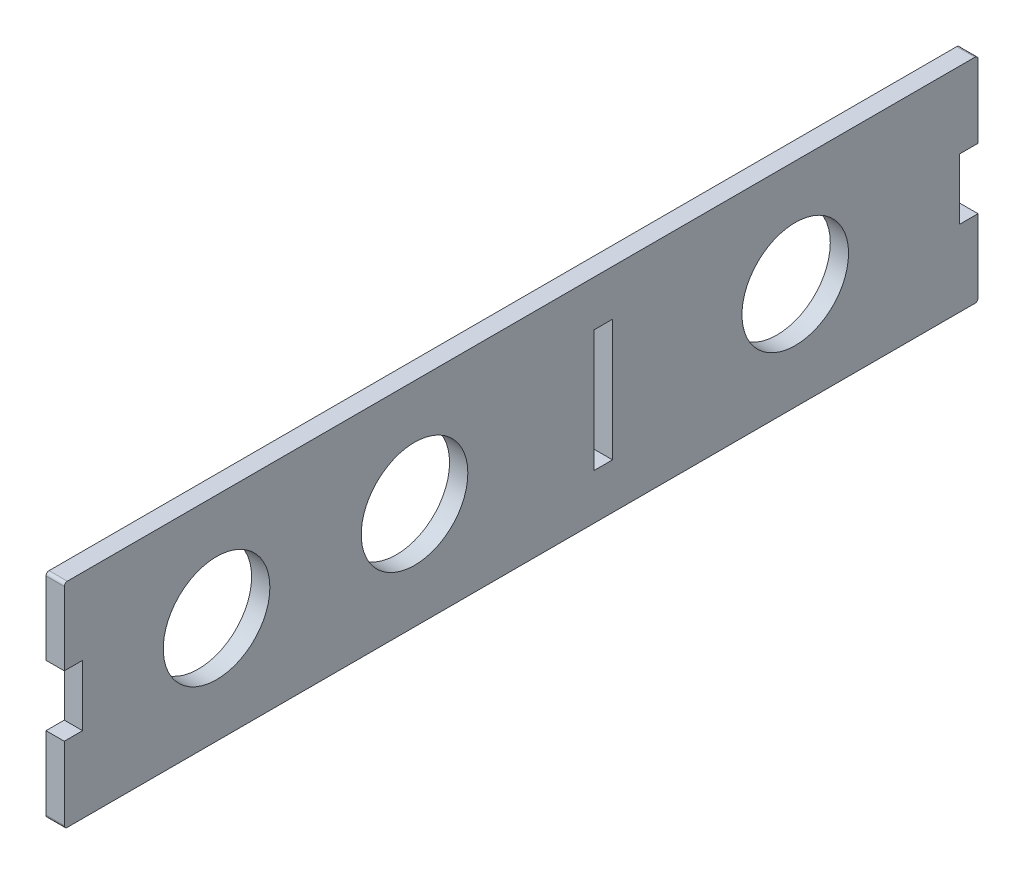
ISO-10303-21;
HEADER;
FILE_DESCRIPTION(('STEP AP214'),'2;1');
FILE_NAME('part.step','',(''),(''),'','','');
FILE_SCHEMA(('AUTOMOTIVE_DESIGN { 1 0 10303 214 1 1 1 1 }'));
ENDSEC;
DATA;
#1=APPLICATION_CONTEXT('core data for automotive mechanical design processes');
#2=APPLICATION_PROTOCOL_DEFINITION('international standard','automotive_design',2000,#1);
#3=PRODUCT_CONTEXT('',#1,'mechanical');
#4=PRODUCT('Part','Part','',(#3));
#5=PRODUCT_RELATED_PRODUCT_CATEGORY('part','',(#4));
#6=PRODUCT_DEFINITION_FORMATION('','',#4);
#7=PRODUCT_DEFINITION_CONTEXT('part definition',#1,'design');
#8=PRODUCT_DEFINITION('design','',#6,#7);
#9=PRODUCT_DEFINITION_SHAPE('','',#8);
#10=(LENGTH_UNIT() NAMED_UNIT(*) SI_UNIT(.MILLI.,.METRE.));
#11=(NAMED_UNIT(*) PLANE_ANGLE_UNIT() SI_UNIT($,.RADIAN.));
#12=(NAMED_UNIT(*) SI_UNIT($,.STERADIAN.) SOLID_ANGLE_UNIT());
#13=UNCERTAINTY_MEASURE_WITH_UNIT(LENGTH_MEASURE(1.E-05),#10,'distance_accuracy_value','');
#14=(GEOMETRIC_REPRESENTATION_CONTEXT(3) GLOBAL_UNCERTAINTY_ASSIGNED_CONTEXT((#13)) GLOBAL_UNIT_ASSIGNED_CONTEXT((#10,
#11,#12)) REPRESENTATION_CONTEXT('',''));
#15=CARTESIAN_POINT('',(0.,0.,0.));
#16=DIRECTION('',(0.,0.,1.));
#17=DIRECTION('',(1.,0.,0.));
#18=AXIS2_PLACEMENT_3D('',#15,#16,#17);
#19=CARTESIAN_POINT('',(6.,70.,0.));
#20=DIRECTION('',(-1.,0.,0.));
#21=DIRECTION('',(0.,0.,1.));
#22=AXIS2_PLACEMENT_3D('',#19,#20,#21);
#23=PLANE('',#22);
#24=CARTESIAN_POINT('',(6.,35.,-240.));
#25=DIRECTION('',(1.,0.,0.));
#26=DIRECTION('',(0.,0.,-1.));
#27=AXIS2_PLACEMENT_3D('',#24,#25,#26);
#28=CIRCLE('',#27,17.5);
#29=CARTESIAN_POINT('',(6.,35.,-257.5));
#30=VERTEX_POINT('',#29);
#31=EDGE_CURVE('E617',#30,#30,#28,.T.);
#32=ORIENTED_EDGE('',*,*,#31,.F.);
#33=EDGE_LOOP('',(#32));
#34=FACE_BOUND('',#33,.T.);
#35=CARTESIAN_POINT('',(6.,35.,-115.));
#36=DIRECTION('',(1.,0.,0.));
#37=DIRECTION('',(0.,0.,-1.));
#38=AXIS2_PLACEMENT_3D('',#35,#36,#37);
#39=CIRCLE('',#38,17.5);
#40=CARTESIAN_POINT('',(6.,35.,-132.5));
#41=VERTEX_POINT('',#40);
#42=EDGE_CURVE('E609',#41,#41,#39,.T.);
#43=ORIENTED_EDGE('',*,*,#42,.F.);
#44=EDGE_LOOP('',(#43));
#45=FACE_BOUND('',#44,.T.);
#46=CARTESIAN_POINT('',(6.,35.,-50.));
#47=DIRECTION('',(1.,0.,0.));
#48=DIRECTION('',(0.,0.,-1.));
#49=AXIS2_PLACEMENT_3D('',#46,#47,#48);
#50=CIRCLE('',#49,17.5);
#51=CARTESIAN_POINT('',(6.,35.,-67.5));
#52=VERTEX_POINT('',#51);
#53=EDGE_CURVE('E200',#52,#52,#50,.T.);
#54=ORIENTED_EDGE('',*,*,#53,.F.);
#55=EDGE_LOOP('',(#54));
#56=FACE_BOUND('',#55,.T.);
#57=DIRECTION('',(0.,0.,-1.));
#58=VECTOR('',#57,1.);
#59=CARTESIAN_POINT('',(6.,54.9999999999993,-389.754651374949));
#60=LINE('',#59,#58);
#61=CARTESIAN_POINT('',(6.,55.,-174.));
#62=VERTEX_POINT('',#61);
#63=CARTESIAN_POINT('',(6.,55.,-180.));
#64=VERTEX_POINT('',#63);
#65=EDGE_CURVE('E234',#62,#64,#60,.T.);
#66=ORIENTED_EDGE('',*,*,#65,.T.);
#67=DIRECTION('',(0.,1.,0.));
#68=VECTOR('',#67,1.);
#69=CARTESIAN_POINT('',(6.,35.,-180.));
#70=LINE('',#69,#68);
#71=CARTESIAN_POINT('',(6.,15.,-180.));
#72=VERTEX_POINT('',#71);
#73=EDGE_CURVE('E244',#72,#64,#70,.T.);
#74=ORIENTED_EDGE('',*,*,#73,.F.);
#75=DIRECTION('',(0.,0.,-1.));
#76=VECTOR('',#75,1.);
#77=CARTESIAN_POINT('',(6.,15.,-389.754651374949));
#78=LINE('',#77,#76);
#79=CARTESIAN_POINT('',(6.,15.,-174.));
#80=VERTEX_POINT('',#79);
#81=EDGE_CURVE('E259',#80,#72,#78,.T.);
#82=ORIENTED_EDGE('',*,*,#81,.F.);
#83=DIRECTION('',(0.,-1.,0.));
#84=VECTOR('',#83,1.);
#85=CARTESIAN_POINT('',(6.,35.,-174.));
#86=LINE('',#85,#84);
#87=EDGE_CURVE('E256',#62,#80,#86,.T.);
#88=ORIENTED_EDGE('',*,*,#87,.F.);
#89=EDGE_LOOP('',(#66,#74,#82,#88));
#90=FACE_BOUND('',#89,.T.);
#91=DIRECTION('',(0.,0.,-1.));
#92=VECTOR('',#91,1.);
#93=CARTESIAN_POINT('',(6.,0.,0.));
#94=LINE('',#93,#92);
#95=CARTESIAN_POINT('',(6.,0.,-1.));
#96=VERTEX_POINT('',#95);
#97=CARTESIAN_POINT('',(6.,0.,-299.));
#98=VERTEX_POINT('',#97);
#99=EDGE_CURVE('E274',#96,#98,#94,.T.);
#100=ORIENTED_EDGE('',*,*,#99,.T.);
#101=CARTESIAN_POINT('',(6.,1.,-299.));
#102=DIRECTION('',(-1.,0.,0.));
#103=DIRECTION('',(0.,0.,1.));
#104=AXIS2_PLACEMENT_3D('',#101,#102,#103);
#105=CIRCLE('',#104,1.);
#106=CARTESIAN_POINT('',(6.,1.,-300.));
#107=VERTEX_POINT('',#106);
#108=EDGE_CURVE('E314',#98,#107,#105,.F.);
#109=ORIENTED_EDGE('',*,*,#108,.T.);
#110=DIRECTION('',(0.,1.,0.));
#111=VECTOR('',#110,1.);
#112=CARTESIAN_POINT('',(6.,0.,-300.));
#113=LINE('',#112,#111);
#114=CARTESIAN_POINT('',(6.,25.0000000000002,-300.));
#115=VERTEX_POINT('',#114);
#116=EDGE_CURVE('E279',#107,#115,#113,.T.);
#117=ORIENTED_EDGE('',*,*,#116,.T.);
#118=DIRECTION('',(0.,0.,-1.));
#119=VECTOR('',#118,1.);
#120=CARTESIAN_POINT('',(6.,25.0000000000002,-389.754651374949));
#121=LINE('',#120,#119);
#122=CARTESIAN_POINT('',(6.,25.0000000000002,-294.));
#123=VERTEX_POINT('',#122);
#124=EDGE_CURVE('E227',#123,#115,#121,.T.);
#125=ORIENTED_EDGE('',*,*,#124,.F.);
#126=DIRECTION('',(0.,-1.,0.));
#127=VECTOR('',#126,1.);
#128=CARTESIAN_POINT('',(6.,35.,-294.));
#129=LINE('',#128,#127);
#130=CARTESIAN_POINT('',(6.,45.,-294.));
#131=VERTEX_POINT('',#130);
#132=EDGE_CURVE('E209',#131,#123,#129,.T.);
#133=ORIENTED_EDGE('',*,*,#132,.F.);
#134=DIRECTION('',(0.,0.,1.));
#135=VECTOR('',#134,1.);
#136=CARTESIAN_POINT('',(6.,45.,-389.754651374949));
#137=LINE('',#136,#135);
#138=CARTESIAN_POINT('',(6.,45.,-300.));
#139=VERTEX_POINT('',#138);
#140=EDGE_CURVE('E218',#139,#131,#137,.T.);
#141=ORIENTED_EDGE('',*,*,#140,.F.);
#142=CARTESIAN_POINT('',(6.,69.,-300.));
#143=VERTEX_POINT('',#142);
#144=EDGE_CURVE('E278',#139,#143,#113,.T.);
#145=ORIENTED_EDGE('',*,*,#144,.T.);
#146=CARTESIAN_POINT('',(6.,69.,-299.));
#147=DIRECTION('',(-1.,0.,0.));
#148=DIRECTION('',(0.,0.,1.));
#149=AXIS2_PLACEMENT_3D('',#146,#147,#148);
#150=CIRCLE('',#149,1.);
#151=CARTESIAN_POINT('',(6.,70.,-299.));
#152=VERTEX_POINT('',#151);
#153=EDGE_CURVE('E312',#143,#152,#150,.F.);
#154=ORIENTED_EDGE('',*,*,#153,.T.);
#155=DIRECTION('',(0.,0.,1.));
#156=VECTOR('',#155,1.);
#157=CARTESIAN_POINT('',(6.,70.,0.));
#158=LINE('',#157,#156);
#159=CARTESIAN_POINT('',(6.,70.,-1.));
#160=VERTEX_POINT('',#159);
#161=EDGE_CURVE('E281',#152,#160,#158,.T.);
#162=ORIENTED_EDGE('',*,*,#161,.T.);
#163=CARTESIAN_POINT('',(6.,69.,-1.));
#164=DIRECTION('',(-1.,0.,0.));
#165=DIRECTION('',(0.,0.,1.));
#166=AXIS2_PLACEMENT_3D('',#163,#164,#165);
#167=CIRCLE('',#166,1.);
#168=CARTESIAN_POINT('',(6.,69.,0.));
#169=VERTEX_POINT('',#168);
#170=EDGE_CURVE('E45',#160,#169,#167,.F.);
#171=ORIENTED_EDGE('',*,*,#170,.T.);
#172=DIRECTION('',(0.,-1.,0.));
#173=VECTOR('',#172,1.);
#174=CARTESIAN_POINT('',(6.,0.,0.));
#175=LINE('',#174,#173);
#176=CARTESIAN_POINT('',(6.,45.,0.));
#177=VERTEX_POINT('',#176);
#178=EDGE_CURVE('E272',#169,#177,#175,.T.);
#179=ORIENTED_EDGE('',*,*,#178,.T.);
#180=DIRECTION('',(0.,0.,-1.));
#181=VECTOR('',#180,1.);
#182=CARTESIAN_POINT('',(6.,45.,-389.754651374949));
#183=LINE('',#182,#181);
#184=CARTESIAN_POINT('',(6.,45.,-6.00000000000001));
#185=VERTEX_POINT('',#184);
#186=EDGE_CURVE('E194',#177,#185,#183,.T.);
#187=ORIENTED_EDGE('',*,*,#186,.T.);
#188=DIRECTION('',(0.,-1.,0.));
#189=VECTOR('',#188,1.);
#190=CARTESIAN_POINT('',(6.,35.,-6.00000000000001));
#191=LINE('',#190,#189);
#192=CARTESIAN_POINT('',(6.,25.,-6.00000000000001));
#193=VERTEX_POINT('',#192);
#194=EDGE_CURVE('E197',#185,#193,#191,.T.);
#195=ORIENTED_EDGE('',*,*,#194,.T.);
#196=DIRECTION('',(0.,0.,1.));
#197=VECTOR('',#196,1.);
#198=CARTESIAN_POINT('',(6.,25.0000000000002,-389.754651374949));
#199=LINE('',#198,#197);
#200=CARTESIAN_POINT('',(6.,25.,0.));
#201=VERTEX_POINT('',#200);
#202=EDGE_CURVE('E186',#193,#201,#199,.T.);
#203=ORIENTED_EDGE('',*,*,#202,.T.);
#204=CARTESIAN_POINT('',(6.,1.,0.));
#205=VERTEX_POINT('',#204);
#206=EDGE_CURVE('E275',#201,#205,#175,.T.);
#207=ORIENTED_EDGE('',*,*,#206,.T.);
#208=CARTESIAN_POINT('',(6.,1.,-1.));
#209=DIRECTION('',(-1.,0.,0.));
#210=DIRECTION('',(0.,0.,1.));
#211=AXIS2_PLACEMENT_3D('',#208,#209,#210);
#212=CIRCLE('',#211,1.);
#213=EDGE_CURVE('E310',#205,#96,#212,.F.);
#214=ORIENTED_EDGE('',*,*,#213,.T.);
#215=EDGE_LOOP('',(#100,#109,#117,#125,#133,#141,#145,#154,#162,#171,#179,#187,#195,#203,#207,#214));
#216=FACE_BOUND('',#215,.T.);
#217=ADVANCED_FACE('F30',(#34,#45,#56,#90,#216),#23,.F.);
#218=CARTESIAN_POINT('',(0.,70.,0.));
#219=DIRECTION('',(-1.,0.,0.));
#220=DIRECTION('',(0.,0.,1.));
#221=AXIS2_PLACEMENT_3D('',#218,#219,#220);
#222=PLANE('',#221);
#223=CARTESIAN_POINT('',(0.,35.,-240.));
#224=DIRECTION('',(1.,0.,0.));
#225=DIRECTION('',(0.,0.,-1.));
#226=AXIS2_PLACEMENT_3D('',#223,#224,#225);
#227=CIRCLE('',#226,17.5);
#228=CARTESIAN_POINT('',(0.,35.,-257.5));
#229=VERTEX_POINT('',#228);
#230=EDGE_CURVE('E614',#229,#229,#227,.T.);
#231=ORIENTED_EDGE('',*,*,#230,.T.);
#232=EDGE_LOOP('',(#231));
#233=FACE_BOUND('',#232,.T.);
#234=CARTESIAN_POINT('',(0.,35.,-115.));
#235=DIRECTION('',(1.,0.,0.));
#236=DIRECTION('',(0.,0.,-1.));
#237=AXIS2_PLACEMENT_3D('',#234,#235,#236);
#238=CIRCLE('',#237,17.5);
#239=CARTESIAN_POINT('',(0.,35.,-132.5));
#240=VERTEX_POINT('',#239);
#241=EDGE_CURVE('E607',#240,#240,#238,.T.);
#242=ORIENTED_EDGE('',*,*,#241,.T.);
#243=EDGE_LOOP('',(#242));
#244=FACE_BOUND('',#243,.T.);
#245=CARTESIAN_POINT('',(0.,35.,-50.));
#246=DIRECTION('',(1.,0.,0.));
#247=DIRECTION('',(0.,0.,-1.));
#248=AXIS2_PLACEMENT_3D('',#245,#246,#247);
#249=CIRCLE('',#248,17.5);
#250=CARTESIAN_POINT('',(0.,35.,-67.5));
#251=VERTEX_POINT('',#250);
#252=EDGE_CURVE('E205',#251,#251,#249,.T.);
#253=ORIENTED_EDGE('',*,*,#252,.T.);
#254=EDGE_LOOP('',(#253));
#255=FACE_BOUND('',#254,.T.);
#256=DIRECTION('',(0.,1.,0.));
#257=VECTOR('',#256,1.);
#258=CARTESIAN_POINT('',(0.,35.,-180.));
#259=LINE('',#258,#257);
#260=CARTESIAN_POINT('',(0.,15.,-180.));
#261=VERTEX_POINT('',#260);
#262=CARTESIAN_POINT('',(0.,55.,-180.));
#263=VERTEX_POINT('',#262);
#264=EDGE_CURVE('E250',#261,#263,#259,.T.);
#265=ORIENTED_EDGE('',*,*,#264,.T.);
#266=DIRECTION('',(0.,0.,-1.));
#267=VECTOR('',#266,1.);
#268=CARTESIAN_POINT('',(0.,54.9999999999993,-389.754651374949));
#269=LINE('',#268,#267);
#270=CARTESIAN_POINT('',(0.,55.,-174.));
#271=VERTEX_POINT('',#270);
#272=EDGE_CURVE('E241',#271,#263,#269,.T.);
#273=ORIENTED_EDGE('',*,*,#272,.F.);
#274=DIRECTION('',(0.,-1.,0.));
#275=VECTOR('',#274,1.);
#276=CARTESIAN_POINT('',(0.,35.,-174.));
#277=LINE('',#276,#275);
#278=CARTESIAN_POINT('',(0.,15.,-174.));
#279=VERTEX_POINT('',#278);
#280=EDGE_CURVE('E243',#271,#279,#277,.T.);
#281=ORIENTED_EDGE('',*,*,#280,.T.);
#282=DIRECTION('',(0.,0.,-1.));
#283=VECTOR('',#282,1.);
#284=CARTESIAN_POINT('',(0.,15.,-389.754651374949));
#285=LINE('',#284,#283);
#286=EDGE_CURVE('E247',#279,#261,#285,.T.);
#287=ORIENTED_EDGE('',*,*,#286,.T.);
#288=EDGE_LOOP('',(#265,#273,#281,#287));
#289=FACE_BOUND('',#288,.T.);
#290=DIRECTION('',(0.,1.,0.));
#291=VECTOR('',#290,1.);
#292=CARTESIAN_POINT('',(0.,0.,-300.));
#293=LINE('',#292,#291);
#294=CARTESIAN_POINT('',(0.,1.,-300.));
#295=VERTEX_POINT('',#294);
#296=CARTESIAN_POINT('',(0.,25.0000000000002,-300.));
#297=VERTEX_POINT('',#296);
#298=EDGE_CURVE('E290',#295,#297,#293,.T.);
#299=ORIENTED_EDGE('',*,*,#298,.F.);
#300=CARTESIAN_POINT('',(0.,1.,-299.));
#301=DIRECTION('',(-1.,0.,0.));
#302=DIRECTION('',(0.,0.,1.));
#303=AXIS2_PLACEMENT_3D('',#300,#301,#302);
#304=CIRCLE('',#303,1.);
#305=CARTESIAN_POINT('',(0.,0.,-299.));
#306=VERTEX_POINT('',#305);
#307=EDGE_CURVE('E302',#295,#306,#304,.T.);
#308=ORIENTED_EDGE('',*,*,#307,.T.);
#309=DIRECTION('',(0.,0.,-1.));
#310=VECTOR('',#309,1.);
#311=CARTESIAN_POINT('',(0.,0.,0.));
#312=LINE('',#311,#310);
#313=CARTESIAN_POINT('',(0.,0.,-1.));
#314=VERTEX_POINT('',#313);
#315=EDGE_CURVE('E286',#314,#306,#312,.T.);
#316=ORIENTED_EDGE('',*,*,#315,.F.);
#317=CARTESIAN_POINT('',(0.,1.,-1.));
#318=DIRECTION('',(-1.,0.,0.));
#319=DIRECTION('',(0.,0.,1.));
#320=AXIS2_PLACEMENT_3D('',#317,#318,#319);
#321=CIRCLE('',#320,1.);
#322=CARTESIAN_POINT('',(0.,1.,0.));
#323=VERTEX_POINT('',#322);
#324=EDGE_CURVE('E298',#314,#323,#321,.T.);
#325=ORIENTED_EDGE('',*,*,#324,.T.);
#326=DIRECTION('',(0.,-1.,0.));
#327=VECTOR('',#326,1.);
#328=CARTESIAN_POINT('',(0.,0.,0.));
#329=LINE('',#328,#327);
#330=CARTESIAN_POINT('',(0.,25.,0.));
#331=VERTEX_POINT('',#330);
#332=EDGE_CURVE('E193',#331,#323,#329,.T.);
#333=ORIENTED_EDGE('',*,*,#332,.F.);
#334=DIRECTION('',(0.,0.,1.));
#335=VECTOR('',#334,1.);
#336=CARTESIAN_POINT('',(0.,25.0000000000002,-389.754651374949));
#337=LINE('',#336,#335);
#338=CARTESIAN_POINT('',(0.,25.,-6.00000000000001));
#339=VERTEX_POINT('',#338);
#340=EDGE_CURVE('E180',#339,#331,#337,.T.);
#341=ORIENTED_EDGE('',*,*,#340,.F.);
#342=DIRECTION('',(0.,-1.,0.));
#343=VECTOR('',#342,1.);
#344=CARTESIAN_POINT('',(0.,35.,-6.00000000000001));
#345=LINE('',#344,#343);
#346=CARTESIAN_POINT('',(0.,45.,-6.00000000000001));
#347=VERTEX_POINT('',#346);
#348=EDGE_CURVE('E169',#347,#339,#345,.T.);
#349=ORIENTED_EDGE('',*,*,#348,.F.);
#350=DIRECTION('',(0.,0.,-1.));
#351=VECTOR('',#350,1.);
#352=CARTESIAN_POINT('',(0.,45.,-389.754651374949));
#353=LINE('',#352,#351);
#354=CARTESIAN_POINT('',(0.,45.,0.));
#355=VERTEX_POINT('',#354);
#356=EDGE_CURVE('E179',#355,#347,#353,.T.);
#357=ORIENTED_EDGE('',*,*,#356,.F.);
#358=CARTESIAN_POINT('',(0.,69.,0.));
#359=VERTEX_POINT('',#358);
#360=EDGE_CURVE('E284',#359,#355,#329,.T.);
#361=ORIENTED_EDGE('',*,*,#360,.F.);
#362=CARTESIAN_POINT('',(0.,69.,-1.));
#363=DIRECTION('',(-1.,0.,0.));
#364=DIRECTION('',(0.,0.,1.));
#365=AXIS2_PLACEMENT_3D('',#362,#363,#364);
#366=CIRCLE('',#365,1.);
#367=CARTESIAN_POINT('',(0.,70.,-1.));
#368=VERTEX_POINT('',#367);
#369=EDGE_CURVE('E296',#359,#368,#366,.T.);
#370=ORIENTED_EDGE('',*,*,#369,.T.);
#371=DIRECTION('',(0.,0.,1.));
#372=VECTOR('',#371,1.);
#373=CARTESIAN_POINT('',(0.,70.,0.));
#374=LINE('',#373,#372);
#375=CARTESIAN_POINT('',(0.,70.,-299.));
#376=VERTEX_POINT('',#375);
#377=EDGE_CURVE('E292',#376,#368,#374,.T.);
#378=ORIENTED_EDGE('',*,*,#377,.F.);
#379=CARTESIAN_POINT('',(0.,69.,-299.));
#380=DIRECTION('',(-1.,0.,0.));
#381=DIRECTION('',(0.,0.,1.));
#382=AXIS2_PLACEMENT_3D('',#379,#380,#381);
#383=CIRCLE('',#382,1.);
#384=CARTESIAN_POINT('',(0.,69.,-300.));
#385=VERTEX_POINT('',#384);
#386=EDGE_CURVE('E300',#376,#385,#383,.T.);
#387=ORIENTED_EDGE('',*,*,#386,.T.);
#388=CARTESIAN_POINT('',(0.,45.,-300.));
#389=VERTEX_POINT('',#388);
#390=EDGE_CURVE('E289',#389,#385,#293,.T.);
#391=ORIENTED_EDGE('',*,*,#390,.F.);
#392=DIRECTION('',(0.,0.,1.));
#393=VECTOR('',#392,1.);
#394=CARTESIAN_POINT('',(0.,45.,-389.754651374949));
#395=LINE('',#394,#393);
#396=CARTESIAN_POINT('',(0.,45.,-294.));
#397=VERTEX_POINT('',#396);
#398=EDGE_CURVE('E221',#389,#397,#395,.T.);
#399=ORIENTED_EDGE('',*,*,#398,.T.);
#400=DIRECTION('',(0.,-1.,0.));
#401=VECTOR('',#400,1.);
#402=CARTESIAN_POINT('',(0.,35.,-294.));
#403=LINE('',#402,#401);
#404=CARTESIAN_POINT('',(0.,25.0000000000002,-294.));
#405=VERTEX_POINT('',#404);
#406=EDGE_CURVE('E214',#397,#405,#403,.T.);
#407=ORIENTED_EDGE('',*,*,#406,.T.);
#408=DIRECTION('',(0.,0.,-1.));
#409=VECTOR('',#408,1.);
#410=CARTESIAN_POINT('',(0.,25.0000000000002,-389.754651374949));
#411=LINE('',#410,#409);
#412=EDGE_CURVE('E217',#405,#297,#411,.T.);
#413=ORIENTED_EDGE('',*,*,#412,.T.);
#414=EDGE_LOOP('',(#299,#308,#316,#325,#333,#341,#349,#357,#361,#370,#378,#387,#391,#399,#407,#413));
#415=FACE_BOUND('',#414,.T.);
#416=ADVANCED_FACE('F191',(#233,#244,#255,#289,#415),#222,.T.);
#417=CARTESIAN_POINT('',(6.,0.,0.));
#418=DIRECTION('',(0.,0.,-1.));
#419=DIRECTION('',(-1.,0.,0.));
#420=AXIS2_PLACEMENT_3D('',#417,#418,#419);
#421=PLANE('',#420);
#422=ORIENTED_EDGE('',*,*,#332,.T.);
#423=DIRECTION('',(-1.,0.,0.));
#424=VECTOR('',#423,1.);
#425=CARTESIAN_POINT('',(6.,1.,0.));
#426=LINE('',#425,#424);
#427=EDGE_CURVE('E38',#323,#205,#426,.F.);
#428=ORIENTED_EDGE('',*,*,#427,.T.);
#429=ORIENTED_EDGE('',*,*,#206,.F.);
#430=DIRECTION('',(1.,0.,0.));
#431=VECTOR('',#430,1.);
#432=CARTESIAN_POINT('',(0.,25.,0.));
#433=LINE('',#432,#431);
#434=EDGE_CURVE('E207',#331,#201,#433,.T.);
#435=ORIENTED_EDGE('',*,*,#434,.F.);
#436=EDGE_LOOP('',(#422,#428,#429,#435));
#437=FACE_BOUND('',#436,.T.);
#438=ADVANCED_FACE('F325',(#437),#421,.F.);
#439=ORIENTED_EDGE('',*,*,#178,.F.);
#440=DIRECTION('',(-1.,0.,0.));
#441=VECTOR('',#440,1.);
#442=CARTESIAN_POINT('',(6.,69.,0.));
#443=LINE('',#442,#441);
#444=EDGE_CURVE('E11',#169,#359,#443,.T.);
#445=ORIENTED_EDGE('',*,*,#444,.T.);
#446=ORIENTED_EDGE('',*,*,#360,.T.);
#447=DIRECTION('',(1.,0.,0.));
#448=VECTOR('',#447,1.);
#449=CARTESIAN_POINT('',(0.,45.,0.));
#450=LINE('',#449,#448);
#451=EDGE_CURVE('E210',#355,#177,#450,.T.);
#452=ORIENTED_EDGE('',*,*,#451,.T.);
#453=EDGE_LOOP('',(#439,#445,#446,#452));
#454=FACE_BOUND('',#453,.T.);
#455=ADVANCED_FACE('F371',(#454),#421,.F.);
#456=CARTESIAN_POINT('',(6.,0.,-300.));
#457=DIRECTION('',(0.,0.,1.));
#458=DIRECTION('',(1.,0.,0.));
#459=AXIS2_PLACEMENT_3D('',#456,#457,#458);
#460=PLANE('',#459);
#461=ORIENTED_EDGE('',*,*,#390,.T.);
#462=DIRECTION('',(-1.,0.,0.));
#463=VECTOR('',#462,1.);
#464=CARTESIAN_POINT('',(6.,69.,-300.));
#465=LINE('',#464,#463);
#466=EDGE_CURVE('E320',#385,#143,#465,.F.);
#467=ORIENTED_EDGE('',*,*,#466,.T.);
#468=ORIENTED_EDGE('',*,*,#144,.F.);
#469=DIRECTION('',(1.,0.,0.));
#470=VECTOR('',#469,1.);
#471=CARTESIAN_POINT('',(0.,45.,-300.));
#472=LINE('',#471,#470);
#473=EDGE_CURVE('E235',#389,#139,#472,.T.);
#474=ORIENTED_EDGE('',*,*,#473,.F.);
#475=EDGE_LOOP('',(#461,#467,#468,#474));
#476=FACE_BOUND('',#475,.T.);
#477=ADVANCED_FACE('F359',(#476),#460,.F.);
#478=CARTESIAN_POINT('',(6.,0.,0.));
#479=DIRECTION('',(0.,1.,0.));
#480=DIRECTION('',(0.,0.,1.));
#481=AXIS2_PLACEMENT_3D('',#478,#479,#480);
#482=PLANE('',#481);
#483=ORIENTED_EDGE('',*,*,#315,.T.);
#484=DIRECTION('',(-1.,0.,0.));
#485=VECTOR('',#484,1.);
#486=CARTESIAN_POINT('',(6.,0.,-299.));
#487=LINE('',#486,#485);
#488=EDGE_CURVE('E307',#306,#98,#487,.F.);
#489=ORIENTED_EDGE('',*,*,#488,.T.);
#490=ORIENTED_EDGE('',*,*,#99,.F.);
#491=DIRECTION('',(-1.,0.,0.));
#492=VECTOR('',#491,1.);
#493=CARTESIAN_POINT('',(6.,0.,-1.));
#494=LINE('',#493,#492);
#495=EDGE_CURVE('E304',#96,#314,#494,.T.);
#496=ORIENTED_EDGE('',*,*,#495,.T.);
#497=EDGE_LOOP('',(#483,#489,#490,#496));
#498=FACE_BOUND('',#497,.T.);
#499=ADVANCED_FACE('F333',(#498),#482,.F.);
#500=ORIENTED_EDGE('',*,*,#116,.F.);
#501=DIRECTION('',(-1.,0.,0.));
#502=VECTOR('',#501,1.);
#503=CARTESIAN_POINT('',(6.,1.,-300.));
#504=LINE('',#503,#502);
#505=EDGE_CURVE('E283',#107,#295,#504,.T.);
#506=ORIENTED_EDGE('',*,*,#505,.T.);
#507=ORIENTED_EDGE('',*,*,#298,.T.);
#508=DIRECTION('',(1.,0.,0.));
#509=VECTOR('',#508,1.);
#510=CARTESIAN_POINT('',(0.,25.0000000000002,-300.));
#511=LINE('',#510,#509);
#512=EDGE_CURVE('E237',#297,#115,#511,.T.);
#513=ORIENTED_EDGE('',*,*,#512,.T.);
#514=EDGE_LOOP('',(#500,#506,#507,#513));
#515=FACE_BOUND('',#514,.T.);
#516=ADVANCED_FACE('F341',(#515),#460,.F.);
#517=CARTESIAN_POINT('',(6.,70.,0.));
#518=DIRECTION('',(0.,-1.,0.));
#519=DIRECTION('',(0.,0.,-1.));
#520=AXIS2_PLACEMENT_3D('',#517,#518,#519);
#521=PLANE('',#520);
#522=ORIENTED_EDGE('',*,*,#161,.F.);
#523=DIRECTION('',(-1.,0.,0.));
#524=VECTOR('',#523,1.);
#525=CARTESIAN_POINT('',(6.,70.,-299.));
#526=LINE('',#525,#524);
#527=EDGE_CURVE('E317',#152,#376,#526,.T.);
#528=ORIENTED_EDGE('',*,*,#527,.T.);
#529=ORIENTED_EDGE('',*,*,#377,.T.);
#530=DIRECTION('',(-1.,0.,0.));
#531=VECTOR('',#530,1.);
#532=CARTESIAN_POINT('',(6.,70.,-1.));
#533=LINE('',#532,#531);
#534=EDGE_CURVE('E53',#368,#160,#533,.F.);
#535=ORIENTED_EDGE('',*,*,#534,.T.);
#536=EDGE_LOOP('',(#522,#528,#529,#535));
#537=FACE_BOUND('',#536,.T.);
#538=ADVANCED_FACE('F365',(#537),#521,.F.);
#539=CARTESIAN_POINT('',(0.,54.9999999999993,-389.754651374949));
#540=DIRECTION('',(0.,-1.,0.));
#541=DIRECTION('',(0.,0.,-1.));
#542=AXIS2_PLACEMENT_3D('',#539,#540,#541);
#543=PLANE('',#542);
#544=ORIENTED_EDGE('',*,*,#65,.F.);
#545=DIRECTION('',(1.,0.,0.));
#546=VECTOR('',#545,1.);
#547=CARTESIAN_POINT('',(0.,55.,-174.));
#548=LINE('',#547,#546);
#549=EDGE_CURVE('E253',#271,#62,#548,.T.);
#550=ORIENTED_EDGE('',*,*,#549,.F.);
#551=ORIENTED_EDGE('',*,*,#272,.T.);
#552=DIRECTION('',(1.,0.,0.));
#553=VECTOR('',#552,1.);
#554=CARTESIAN_POINT('',(0.,55.,-180.));
#555=LINE('',#554,#553);
#556=EDGE_CURVE('E264',#263,#64,#555,.T.);
#557=ORIENTED_EDGE('',*,*,#556,.T.);
#558=EDGE_LOOP('',(#544,#550,#551,#557));
#559=FACE_BOUND('',#558,.T.);
#560=ADVANCED_FACE('F397',(#559),#543,.T.);
#561=CARTESIAN_POINT('',(0.,35.,-180.));
#562=DIRECTION('',(0.,0.,-1.));
#563=DIRECTION('',(-1.,0.,0.));
#564=AXIS2_PLACEMENT_3D('',#561,#562,#563);
#565=PLANE('',#564);
#566=ORIENTED_EDGE('',*,*,#73,.T.);
#567=ORIENTED_EDGE('',*,*,#556,.F.);
#568=ORIENTED_EDGE('',*,*,#264,.F.);
#569=DIRECTION('',(1.,0.,0.));
#570=VECTOR('',#569,1.);
#571=CARTESIAN_POINT('',(0.,15.,-180.));
#572=LINE('',#571,#570);
#573=EDGE_CURVE('E266',#261,#72,#572,.T.);
#574=ORIENTED_EDGE('',*,*,#573,.T.);
#575=EDGE_LOOP('',(#566,#567,#568,#574));
#576=FACE_BOUND('',#575,.T.);
#577=ADVANCED_FACE('F571',(#576),#565,.F.);
#578=CARTESIAN_POINT('',(0.,15.,-389.754651374949));
#579=DIRECTION('',(0.,-1.,0.));
#580=DIRECTION('',(0.,0.,-1.));
#581=AXIS2_PLACEMENT_3D('',#578,#579,#580);
#582=PLANE('',#581);
#583=ORIENTED_EDGE('',*,*,#81,.T.);
#584=ORIENTED_EDGE('',*,*,#573,.F.);
#585=ORIENTED_EDGE('',*,*,#286,.F.);
#586=DIRECTION('',(1.,0.,0.));
#587=VECTOR('',#586,1.);
#588=CARTESIAN_POINT('',(0.,15.,-174.));
#589=LINE('',#588,#587);
#590=EDGE_CURVE('E268',#279,#80,#589,.T.);
#591=ORIENTED_EDGE('',*,*,#590,.T.);
#592=EDGE_LOOP('',(#583,#584,#585,#591));
#593=FACE_BOUND('',#592,.T.);
#594=ADVANCED_FACE('F562',(#593),#582,.F.);
#595=CARTESIAN_POINT('',(0.,35.,-174.));
#596=DIRECTION('',(0.,0.,1.));
#597=DIRECTION('',(1.,0.,0.));
#598=AXIS2_PLACEMENT_3D('',#595,#596,#597);
#599=PLANE('',#598);
#600=ORIENTED_EDGE('',*,*,#87,.T.);
#601=ORIENTED_EDGE('',*,*,#590,.F.);
#602=ORIENTED_EDGE('',*,*,#280,.F.);
#603=ORIENTED_EDGE('',*,*,#549,.T.);
#604=EDGE_LOOP('',(#600,#601,#602,#603));
#605=FACE_BOUND('',#604,.T.);
#606=ADVANCED_FACE('F553',(#605),#599,.F.);
#607=CARTESIAN_POINT('',(0.,35.,-294.));
#608=DIRECTION('',(0.,0.,1.));
#609=DIRECTION('',(1.,0.,0.));
#610=AXIS2_PLACEMENT_3D('',#607,#608,#609);
#611=PLANE('',#610);
#612=ORIENTED_EDGE('',*,*,#132,.T.);
#613=DIRECTION('',(1.,0.,0.));
#614=VECTOR('',#613,1.);
#615=CARTESIAN_POINT('',(0.,25.0000000000002,-294.));
#616=LINE('',#615,#614);
#617=EDGE_CURVE('E224',#405,#123,#616,.T.);
#618=ORIENTED_EDGE('',*,*,#617,.F.);
#619=ORIENTED_EDGE('',*,*,#406,.F.);
#620=DIRECTION('',(1.,0.,0.));
#621=VECTOR('',#620,1.);
#622=CARTESIAN_POINT('',(0.,45.,-294.));
#623=LINE('',#622,#621);
#624=EDGE_CURVE('E232',#397,#131,#623,.T.);
#625=ORIENTED_EDGE('',*,*,#624,.T.);
#626=EDGE_LOOP('',(#612,#618,#619,#625));
#627=FACE_BOUND('',#626,.T.);
#628=ADVANCED_FACE('F350',(#627),#611,.F.);
#629=CARTESIAN_POINT('',(0.,45.,-389.754651374949));
#630=DIRECTION('',(0.,1.,0.));
#631=DIRECTION('',(0.,0.,1.));
#632=AXIS2_PLACEMENT_3D('',#629,#630,#631);
#633=PLANE('',#632);
#634=ORIENTED_EDGE('',*,*,#140,.T.);
#635=ORIENTED_EDGE('',*,*,#624,.F.);
#636=ORIENTED_EDGE('',*,*,#398,.F.);
#637=ORIENTED_EDGE('',*,*,#473,.T.);
#638=EDGE_LOOP('',(#634,#635,#636,#637));
#639=FACE_BOUND('',#638,.T.);
#640=ADVANCED_FACE('F536',(#639),#633,.F.);
#641=CARTESIAN_POINT('',(0.,25.0000000000002,-389.754651374949));
#642=DIRECTION('',(0.,-1.,0.));
#643=DIRECTION('',(0.,0.,-1.));
#644=AXIS2_PLACEMENT_3D('',#641,#642,#643);
#645=PLANE('',#644);
#646=ORIENTED_EDGE('',*,*,#124,.T.);
#647=ORIENTED_EDGE('',*,*,#512,.F.);
#648=ORIENTED_EDGE('',*,*,#412,.F.);
#649=ORIENTED_EDGE('',*,*,#617,.T.);
#650=EDGE_LOOP('',(#646,#647,#648,#649));
#651=FACE_BOUND('',#650,.T.);
#652=ADVANCED_FACE('F346',(#651),#645,.F.);
#653=CARTESIAN_POINT('',(0.,25.0000000000002,-389.754651374949));
#654=DIRECTION('',(0.,1.,0.));
#655=DIRECTION('',(0.,0.,1.));
#656=AXIS2_PLACEMENT_3D('',#653,#654,#655);
#657=PLANE('',#656);
#658=ORIENTED_EDGE('',*,*,#202,.F.);
#659=DIRECTION('',(1.,0.,0.));
#660=VECTOR('',#659,1.);
#661=CARTESIAN_POINT('',(0.,25.,-6.00000000000001));
#662=LINE('',#661,#660);
#663=EDGE_CURVE('E173',#339,#193,#662,.T.);
#664=ORIENTED_EDGE('',*,*,#663,.F.);
#665=ORIENTED_EDGE('',*,*,#340,.T.);
#666=ORIENTED_EDGE('',*,*,#434,.T.);
#667=EDGE_LOOP('',(#658,#664,#665,#666));
#668=FACE_BOUND('',#667,.T.);
#669=ADVANCED_FACE('F183',(#668),#657,.T.);
#670=CARTESIAN_POINT('',(0.,45.,-389.754651374949));
#671=DIRECTION('',(0.,-1.,0.));
#672=DIRECTION('',(0.,0.,-1.));
#673=AXIS2_PLACEMENT_3D('',#670,#671,#672);
#674=PLANE('',#673);
#675=ORIENTED_EDGE('',*,*,#186,.F.);
#676=ORIENTED_EDGE('',*,*,#451,.F.);
#677=ORIENTED_EDGE('',*,*,#356,.T.);
#678=DIRECTION('',(1.,0.,0.));
#679=VECTOR('',#678,1.);
#680=CARTESIAN_POINT('',(0.,45.,-6.00000000000001));
#681=LINE('',#680,#679);
#682=EDGE_CURVE('E175',#347,#185,#681,.T.);
#683=ORIENTED_EDGE('',*,*,#682,.T.);
#684=EDGE_LOOP('',(#675,#676,#677,#683));
#685=FACE_BOUND('',#684,.T.);
#686=ADVANCED_FACE('F375',(#685),#674,.T.);
#687=CARTESIAN_POINT('',(0.,35.,-6.00000000000001));
#688=DIRECTION('',(0.,0.,1.));
#689=DIRECTION('',(0.,-1.,0.));
#690=AXIS2_PLACEMENT_3D('',#687,#688,#689);
#691=PLANE('',#690);
#692=ORIENTED_EDGE('',*,*,#194,.F.);
#693=ORIENTED_EDGE('',*,*,#682,.F.);
#694=ORIENTED_EDGE('',*,*,#348,.T.);
#695=ORIENTED_EDGE('',*,*,#663,.T.);
#696=EDGE_LOOP('',(#692,#693,#694,#695));
#697=FACE_BOUND('',#696,.T.);
#698=ADVANCED_FACE('F172',(#697),#691,.T.);
#699=CARTESIAN_POINT('',(0.,35.,-50.));
#700=DIRECTION('',(1.,0.,0.));
#701=DIRECTION('',(0.,0.,-1.));
#702=AXIS2_PLACEMENT_3D('',#699,#700,#701);
#703=CYLINDRICAL_SURFACE('',#702,17.5);
#704=ORIENTED_EDGE('',*,*,#252,.F.);
#705=EDGE_LOOP('',(#704));
#706=FACE_BOUND('',#705,.T.);
#707=ORIENTED_EDGE('',*,*,#53,.T.);
#708=EDGE_LOOP('',(#707));
#709=FACE_BOUND('',#708,.T.);
#710=ADVANCED_FACE('F382',(#706,#709),#703,.F.);
#711=CARTESIAN_POINT('',(0.,35.,-115.));
#712=DIRECTION('',(1.,0.,0.));
#713=DIRECTION('',(0.,0.,-1.));
#714=AXIS2_PLACEMENT_3D('',#711,#712,#713);
#715=CYLINDRICAL_SURFACE('',#714,17.5);
#716=ORIENTED_EDGE('',*,*,#241,.F.);
#717=EDGE_LOOP('',(#716));
#718=FACE_BOUND('',#717,.T.);
#719=ORIENTED_EDGE('',*,*,#42,.T.);
#720=EDGE_LOOP('',(#719));
#721=FACE_BOUND('',#720,.T.);
#722=ADVANCED_FACE('F493',(#718,#721),#715,.F.);
#723=CARTESIAN_POINT('',(0.,35.,-240.));
#724=DIRECTION('',(1.,0.,0.));
#725=DIRECTION('',(0.,0.,-1.));
#726=AXIS2_PLACEMENT_3D('',#723,#724,#725);
#727=CYLINDRICAL_SURFACE('',#726,17.5);
#728=ORIENTED_EDGE('',*,*,#230,.F.);
#729=EDGE_LOOP('',(#728));
#730=FACE_BOUND('',#729,.T.);
#731=ORIENTED_EDGE('',*,*,#31,.T.);
#732=EDGE_LOOP('',(#731));
#733=FACE_BOUND('',#732,.T.);
#734=ADVANCED_FACE('F410',(#730,#733),#727,.F.);
#735=CARTESIAN_POINT('',(6.,1.,-299.));
#736=DIRECTION('',(-1.,0.,0.));
#737=DIRECTION('',(0.,0.,1.));
#738=AXIS2_PLACEMENT_3D('',#735,#736,#737);
#739=CYLINDRICAL_SURFACE('',#738,1.);
#740=ORIENTED_EDGE('',*,*,#108,.F.);
#741=ORIENTED_EDGE('',*,*,#488,.F.);
#742=ORIENTED_EDGE('',*,*,#307,.F.);
#743=ORIENTED_EDGE('',*,*,#505,.F.);
#744=EDGE_LOOP('',(#740,#741,#742,#743));
#745=FACE_BOUND('',#744,.T.);
#746=ADVANCED_FACE('F338',(#745),#739,.T.);
#747=CARTESIAN_POINT('',(6.,69.,-299.));
#748=DIRECTION('',(-1.,0.,0.));
#749=DIRECTION('',(0.,0.,1.));
#750=AXIS2_PLACEMENT_3D('',#747,#748,#749);
#751=CYLINDRICAL_SURFACE('',#750,1.);
#752=ORIENTED_EDGE('',*,*,#153,.F.);
#753=ORIENTED_EDGE('',*,*,#466,.F.);
#754=ORIENTED_EDGE('',*,*,#386,.F.);
#755=ORIENTED_EDGE('',*,*,#527,.F.);
#756=EDGE_LOOP('',(#752,#753,#754,#755));
#757=FACE_BOUND('',#756,.T.);
#758=ADVANCED_FACE('F363',(#757),#751,.T.);
#759=CARTESIAN_POINT('',(6.,1.,-1.));
#760=DIRECTION('',(-1.,0.,0.));
#761=DIRECTION('',(0.,0.,1.));
#762=AXIS2_PLACEMENT_3D('',#759,#760,#761);
#763=CYLINDRICAL_SURFACE('',#762,1.);
#764=ORIENTED_EDGE('',*,*,#213,.F.);
#765=ORIENTED_EDGE('',*,*,#427,.F.);
#766=ORIENTED_EDGE('',*,*,#324,.F.);
#767=ORIENTED_EDGE('',*,*,#495,.F.);
#768=EDGE_LOOP('',(#764,#765,#766,#767));
#769=FACE_BOUND('',#768,.T.);
#770=ADVANCED_FACE('F330',(#769),#763,.T.);
#771=CARTESIAN_POINT('',(6.,69.,-1.));
#772=DIRECTION('',(-1.,0.,0.));
#773=DIRECTION('',(0.,0.,1.));
#774=AXIS2_PLACEMENT_3D('',#771,#772,#773);
#775=CYLINDRICAL_SURFACE('',#774,1.);
#776=ORIENTED_EDGE('',*,*,#170,.F.);
#777=ORIENTED_EDGE('',*,*,#534,.F.);
#778=ORIENTED_EDGE('',*,*,#369,.F.);
#779=ORIENTED_EDGE('',*,*,#444,.F.);
#780=EDGE_LOOP('',(#776,#777,#778,#779));
#781=FACE_BOUND('',#780,.T.);
#782=ADVANCED_FACE('F32',(#781),#775,.T.);
#783=CLOSED_SHELL('',(#217,#416,#438,#455,#477,#499,#516,#538,#560,#577,#594,#606,#628,#640,
#652,#669,#686,#698,#710,#722,#734,#746,#758,#770,#782));
#784=MANIFOLD_SOLID_BREP('B2',#783);
#785=ADVANCED_BREP_SHAPE_REPRESENTATION('',(#18,#784),#14);
#786=SHAPE_DEFINITION_REPRESENTATION(#9,#785);
ENDSEC;
END-ISO-10303-21;
